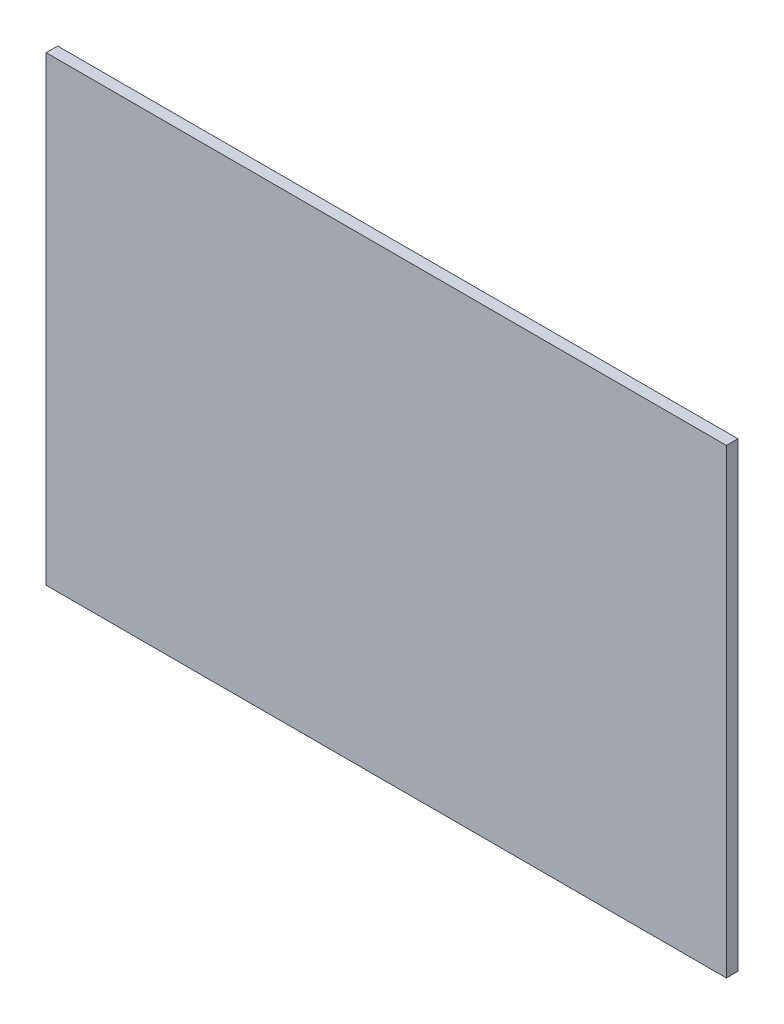
ISO-10303-21;
HEADER;
FILE_DESCRIPTION(('STEP AP214'),'2;1');
FILE_NAME('part.step','',(''),(''),'','','');
FILE_SCHEMA(('AUTOMOTIVE_DESIGN { 1 0 10303 214 1 1 1 1 }'));
ENDSEC;
DATA;
#1=APPLICATION_CONTEXT('core data for automotive mechanical design processes');
#2=APPLICATION_PROTOCOL_DEFINITION('international standard','automotive_design',2000,#1);
#3=PRODUCT_CONTEXT('',#1,'mechanical');
#4=PRODUCT('Part','Part','',(#3));
#5=PRODUCT_RELATED_PRODUCT_CATEGORY('part','',(#4));
#6=PRODUCT_DEFINITION_FORMATION('','',#4);
#7=PRODUCT_DEFINITION_CONTEXT('part definition',#1,'design');
#8=PRODUCT_DEFINITION('design','',#6,#7);
#9=PRODUCT_DEFINITION_SHAPE('','',#8);
#10=(LENGTH_UNIT() NAMED_UNIT(*) SI_UNIT(.MILLI.,.METRE.));
#11=(NAMED_UNIT(*) PLANE_ANGLE_UNIT() SI_UNIT($,.RADIAN.));
#12=(NAMED_UNIT(*) SI_UNIT($,.STERADIAN.) SOLID_ANGLE_UNIT());
#13=UNCERTAINTY_MEASURE_WITH_UNIT(LENGTH_MEASURE(1.E-05),#10,'distance_accuracy_value','');
#14=(GEOMETRIC_REPRESENTATION_CONTEXT(3) GLOBAL_UNCERTAINTY_ASSIGNED_CONTEXT((#13)) GLOBAL_UNIT_ASSIGNED_CONTEXT((#10,
#11,#12)) REPRESENTATION_CONTEXT('',''));
#15=CARTESIAN_POINT('',(0.,0.,0.));
#16=DIRECTION('',(0.,0.,1.));
#17=DIRECTION('',(1.,0.,0.));
#18=AXIS2_PLACEMENT_3D('',#15,#16,#17);
#19=CARTESIAN_POINT('',(147.5,100.,5.));
#20=DIRECTION('',(-1.,0.,0.));
#21=DIRECTION('',(0.,-1.,0.));
#22=AXIS2_PLACEMENT_3D('',#19,#20,#21);
#23=PLANE('',#22);
#24=DIRECTION('',(0.,1.,0.));
#25=VECTOR('',#24,1.);
#26=CARTESIAN_POINT('',(147.5,100.,0.));
#27=LINE('',#26,#25);
#28=CARTESIAN_POINT('',(147.5,-100.,0.));
#29=VERTEX_POINT('',#28);
#30=CARTESIAN_POINT('',(147.5,100.,0.));
#31=VERTEX_POINT('',#30);
#32=EDGE_CURVE('E107',#29,#31,#27,.T.);
#33=ORIENTED_EDGE('',*,*,#32,.T.);
#34=DIRECTION('',(0.,0.,-1.));
#35=VECTOR('',#34,1.);
#36=CARTESIAN_POINT('',(147.5,100.,5.));
#37=LINE('',#36,#35);
#38=CARTESIAN_POINT('',(147.5,100.,5.));
#39=VERTEX_POINT('',#38);
#40=EDGE_CURVE('E11',#39,#31,#37,.T.);
#41=ORIENTED_EDGE('',*,*,#40,.F.);
#42=DIRECTION('',(0.,1.,0.));
#43=VECTOR('',#42,1.);
#44=CARTESIAN_POINT('',(147.5,100.,5.));
#45=LINE('',#44,#43);
#46=CARTESIAN_POINT('',(147.5,-100.,5.));
#47=VERTEX_POINT('',#46);
#48=EDGE_CURVE('E91',#47,#39,#45,.T.);
#49=ORIENTED_EDGE('',*,*,#48,.F.);
#50=DIRECTION('',(0.,0.,-1.));
#51=VECTOR('',#50,1.);
#52=CARTESIAN_POINT('',(147.5,-100.,5.));
#53=LINE('',#52,#51);
#54=EDGE_CURVE('E103',#47,#29,#53,.T.);
#55=ORIENTED_EDGE('',*,*,#54,.T.);
#56=EDGE_LOOP('',(#33,#41,#49,#55));
#57=FACE_BOUND('',#56,.T.);
#58=ADVANCED_FACE('F39',(#57),#23,.F.);
#59=CARTESIAN_POINT('',(-147.5,100.,5.));
#60=DIRECTION('',(0.,-1.,0.));
#61=DIRECTION('',(0.,0.,-1.));
#62=AXIS2_PLACEMENT_3D('',#59,#60,#61);
#63=PLANE('',#62);
#64=DIRECTION('',(-1.,0.,0.));
#65=VECTOR('',#64,1.);
#66=CARTESIAN_POINT('',(-147.5,100.,0.));
#67=LINE('',#66,#65);
#68=CARTESIAN_POINT('',(-147.5,100.,0.));
#69=VERTEX_POINT('',#68);
#70=EDGE_CURVE('E96',#31,#69,#67,.T.);
#71=ORIENTED_EDGE('',*,*,#70,.T.);
#72=DIRECTION('',(0.,0.,-1.));
#73=VECTOR('',#72,1.);
#74=CARTESIAN_POINT('',(-147.5,100.,5.));
#75=LINE('',#74,#73);
#76=CARTESIAN_POINT('',(-147.5,100.,5.));
#77=VERTEX_POINT('',#76);
#78=EDGE_CURVE('E48',#77,#69,#75,.T.);
#79=ORIENTED_EDGE('',*,*,#78,.F.);
#80=DIRECTION('',(-1.,0.,0.));
#81=VECTOR('',#80,1.);
#82=CARTESIAN_POINT('',(-147.5,100.,5.));
#83=LINE('',#82,#81);
#84=EDGE_CURVE('E86',#39,#77,#83,.T.);
#85=ORIENTED_EDGE('',*,*,#84,.F.);
#86=ORIENTED_EDGE('',*,*,#40,.T.);
#87=EDGE_LOOP('',(#71,#79,#85,#86));
#88=FACE_BOUND('',#87,.T.);
#89=ADVANCED_FACE('F95',(#88),#63,.F.);
#90=CARTESIAN_POINT('',(-147.5,100.,5.));
#91=DIRECTION('',(1.,0.,0.));
#92=DIRECTION('',(0.,0.,-1.));
#93=AXIS2_PLACEMENT_3D('',#90,#91,#92);
#94=PLANE('',#93);
#95=DIRECTION('',(0.,-1.,0.));
#96=VECTOR('',#95,1.);
#97=CARTESIAN_POINT('',(-147.5,100.,0.));
#98=LINE('',#97,#96);
#99=CARTESIAN_POINT('',(-147.5,-100.,0.));
#100=VERTEX_POINT('',#99);
#101=EDGE_CURVE('E73',#69,#100,#98,.T.);
#102=ORIENTED_EDGE('',*,*,#101,.T.);
#103=DIRECTION('',(0.,0.,-1.));
#104=VECTOR('',#103,1.);
#105=CARTESIAN_POINT('',(-147.5,-100.,5.));
#106=LINE('',#105,#104);
#107=CARTESIAN_POINT('',(-147.5,-100.,5.));
#108=VERTEX_POINT('',#107);
#109=EDGE_CURVE('E98',#108,#100,#106,.T.);
#110=ORIENTED_EDGE('',*,*,#109,.F.);
#111=DIRECTION('',(0.,-1.,0.));
#112=VECTOR('',#111,1.);
#113=CARTESIAN_POINT('',(-147.5,100.,5.));
#114=LINE('',#113,#112);
#115=EDGE_CURVE('E89',#77,#108,#114,.T.);
#116=ORIENTED_EDGE('',*,*,#115,.F.);
#117=ORIENTED_EDGE('',*,*,#78,.T.);
#118=EDGE_LOOP('',(#102,#110,#116,#117));
#119=FACE_BOUND('',#118,.T.);
#120=ADVANCED_FACE('F99',(#119),#94,.F.);
#121=CARTESIAN_POINT('',(-147.5,-100.,5.));
#122=DIRECTION('',(0.,1.,0.));
#123=DIRECTION('',(0.,0.,1.));
#124=AXIS2_PLACEMENT_3D('',#121,#122,#123);
#125=PLANE('',#124);
#126=DIRECTION('',(1.,0.,0.));
#127=VECTOR('',#126,1.);
#128=CARTESIAN_POINT('',(-147.5,-100.,0.));
#129=LINE('',#128,#127);
#130=EDGE_CURVE('E79',#100,#29,#129,.T.);
#131=ORIENTED_EDGE('',*,*,#130,.T.);
#132=ORIENTED_EDGE('',*,*,#54,.F.);
#133=DIRECTION('',(1.,0.,0.));
#134=VECTOR('',#133,1.);
#135=CARTESIAN_POINT('',(-147.5,-100.,5.));
#136=LINE('',#135,#134);
#137=EDGE_CURVE('E56',#108,#47,#136,.T.);
#138=ORIENTED_EDGE('',*,*,#137,.F.);
#139=ORIENTED_EDGE('',*,*,#109,.T.);
#140=EDGE_LOOP('',(#131,#132,#138,#139));
#141=FACE_BOUND('',#140,.T.);
#142=ADVANCED_FACE('F120',(#141),#125,.F.);
#143=CARTESIAN_POINT('',(0.,0.,5.));
#144=DIRECTION('',(0.,0.,1.));
#145=DIRECTION('',(1.,0.,0.));
#146=AXIS2_PLACEMENT_3D('',#143,#144,#145);
#147=PLANE('',#146);
#148=ORIENTED_EDGE('',*,*,#48,.T.);
#149=ORIENTED_EDGE('',*,*,#84,.T.);
#150=ORIENTED_EDGE('',*,*,#115,.T.);
#151=ORIENTED_EDGE('',*,*,#137,.T.);
#152=EDGE_LOOP('',(#148,#149,#150,#151));
#153=FACE_BOUND('',#152,.T.);
#154=ADVANCED_FACE('F87',(#153),#147,.T.);
#155=CARTESIAN_POINT('',(0.,0.,0.));
#156=DIRECTION('',(0.,0.,1.));
#157=DIRECTION('',(1.,0.,0.));
#158=AXIS2_PLACEMENT_3D('',#155,#156,#157);
#159=PLANE('',#158);
#160=ORIENTED_EDGE('',*,*,#32,.F.);
#161=ORIENTED_EDGE('',*,*,#130,.F.);
#162=ORIENTED_EDGE('',*,*,#101,.F.);
#163=ORIENTED_EDGE('',*,*,#70,.F.);
#164=EDGE_LOOP('',(#160,#161,#162,#163));
#165=FACE_BOUND('',#164,.T.);
#166=ADVANCED_FACE('F123',(#165),#159,.F.);
#167=CLOSED_SHELL('',(#58,#89,#120,#142,#154,#166));
#168=MANIFOLD_SOLID_BREP('B2',#167);
#169=ADVANCED_BREP_SHAPE_REPRESENTATION('',(#18,#168),#14);
#170=SHAPE_DEFINITION_REPRESENTATION(#9,#169);
ENDSEC;
END-ISO-10303-21;
